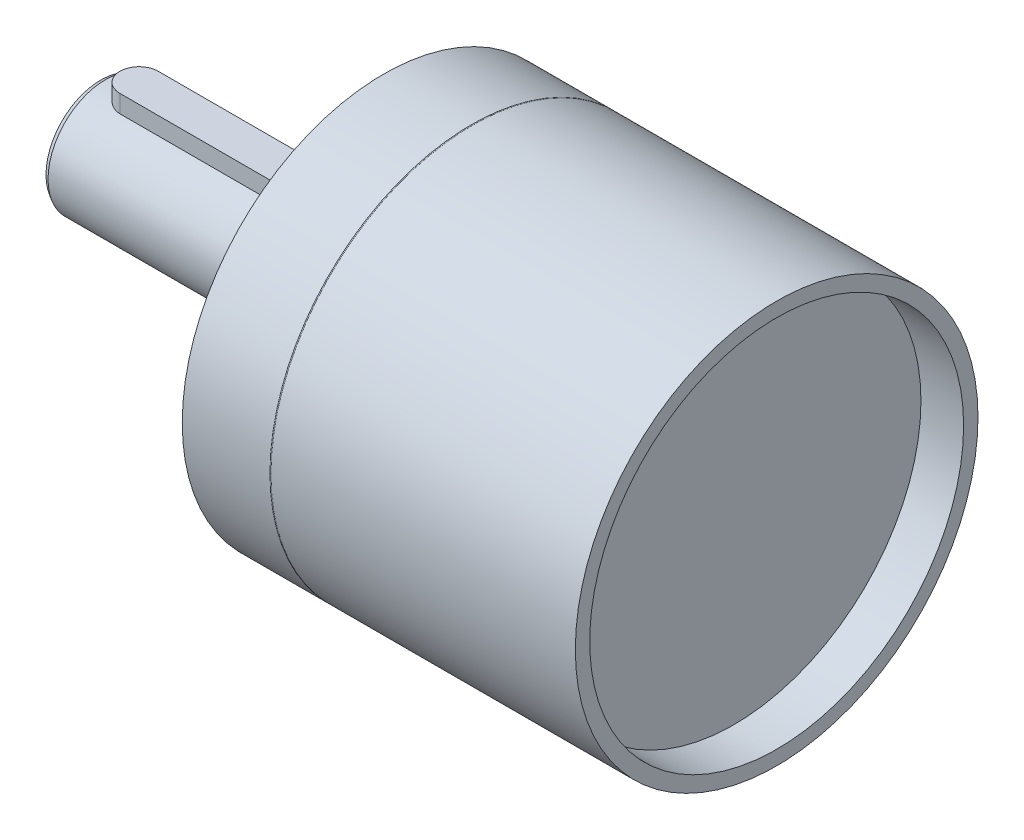
ISO-10303-21;
HEADER;
FILE_DESCRIPTION(('STEP AP214'),'2;1');
FILE_NAME('part.step','',(''),(''),'','','');
FILE_SCHEMA(('AUTOMOTIVE_DESIGN { 1 0 10303 214 1 1 1 1 }'));
ENDSEC;
DATA;
#1=APPLICATION_CONTEXT('core data for automotive mechanical design processes');
#2=APPLICATION_PROTOCOL_DEFINITION('international standard','automotive_design',2000,#1);
#3=PRODUCT_CONTEXT('',#1,'mechanical');
#4=PRODUCT('Part','Part','',(#3));
#5=PRODUCT_RELATED_PRODUCT_CATEGORY('part','',(#4));
#6=PRODUCT_DEFINITION_FORMATION('','',#4);
#7=PRODUCT_DEFINITION_CONTEXT('part definition',#1,'design');
#8=PRODUCT_DEFINITION('design','',#6,#7);
#9=PRODUCT_DEFINITION_SHAPE('','',#8);
#10=(LENGTH_UNIT() NAMED_UNIT(*) SI_UNIT(.MILLI.,.METRE.));
#11=(NAMED_UNIT(*) PLANE_ANGLE_UNIT() SI_UNIT($,.RADIAN.));
#12=(NAMED_UNIT(*) SI_UNIT($,.STERADIAN.) SOLID_ANGLE_UNIT());
#13=UNCERTAINTY_MEASURE_WITH_UNIT(LENGTH_MEASURE(1.E-05),#10,'distance_accuracy_value','');
#14=(GEOMETRIC_REPRESENTATION_CONTEXT(3) GLOBAL_UNCERTAINTY_ASSIGNED_CONTEXT((#13)) GLOBAL_UNIT_ASSIGNED_CONTEXT((#10,
#11,#12)) REPRESENTATION_CONTEXT('',''));
#15=CARTESIAN_POINT('',(0.,0.,0.));
#16=DIRECTION('',(0.,0.,1.));
#17=DIRECTION('',(1.,0.,0.));
#18=AXIS2_PLACEMENT_3D('',#15,#16,#17);
#19=CARTESIAN_POINT('',(0.,1.16808307098715E-12,0.));
#20=DIRECTION('',(1.,0.,0.));
#21=DIRECTION('',(0.,0.,-1.));
#22=AXIS2_PLACEMENT_3D('',#19,#20,#21);
#23=CYLINDRICAL_SURFACE('',#22,21.);
#24=CARTESIAN_POINT('',(0.,1.16808307098715E-12,0.));
#25=DIRECTION('',(1.,0.,0.));
#26=DIRECTION('',(0.,0.,-1.));
#27=AXIS2_PLACEMENT_3D('',#24,#25,#26);
#28=CIRCLE('',#27,21.);
#29=CARTESIAN_POINT('',(0.,1.16808307098715E-12,-21.));
#30=VERTEX_POINT('',#29);
#31=EDGE_CURVE('E198',#30,#30,#28,.T.);
#32=ORIENTED_EDGE('',*,*,#31,.T.);
#33=EDGE_LOOP('',(#32));
#34=FACE_BOUND('',#33,.T.);
#35=CARTESIAN_POINT('',(9.15000000000067,1.16808307098715E-12,0.));
#36=DIRECTION('',(1.,0.,0.));
#37=DIRECTION('',(0.,0.,-1.));
#38=AXIS2_PLACEMENT_3D('',#35,#36,#37);
#39=CIRCLE('',#38,21.);
#40=CARTESIAN_POINT('',(9.15000000000067,1.16808307098715E-12,-21.));
#41=VERTEX_POINT('',#40);
#42=EDGE_CURVE('E209',#41,#41,#39,.T.);
#43=ORIENTED_EDGE('',*,*,#42,.F.);
#44=EDGE_LOOP('',(#43));
#45=FACE_BOUND('',#44,.T.);
#46=ADVANCED_FACE('F34',(#34,#45),#23,.T.);
#47=CARTESIAN_POINT('',(9.20000000000034,1.16920362280837E-12,0.));
#48=DIRECTION('',(1.,0.,0.));
#49=DIRECTION('',(0.,0.,-1.));
#50=AXIS2_PLACEMENT_3D('',#47,#48,#49);
#51=TOROIDAL_SURFACE('',#50,21.0866025403794,0.100000000000672);
#52=ORIENTED_EDGE('',*,*,#42,.T.);
#53=EDGE_LOOP('',(#52));
#54=FACE_BOUND('',#53,.T.);
#55=CARTESIAN_POINT('',(9.25,1.16808307098715E-12,0.));
#56=DIRECTION('',(1.,0.,0.));
#57=DIRECTION('',(0.,0.,-1.));
#58=AXIS2_PLACEMENT_3D('',#55,#56,#57);
#59=CIRCLE('',#58,21.);
#60=CARTESIAN_POINT('',(9.25,1.16808307098715E-12,-21.));
#61=VERTEX_POINT('',#60);
#62=EDGE_CURVE('E206',#61,#61,#59,.T.);
#63=ORIENTED_EDGE('',*,*,#62,.F.);
#64=EDGE_LOOP('',(#63));
#65=FACE_BOUND('',#64,.T.);
#66=ADVANCED_FACE('F226',(#54,#65),#51,.F.);
#67=CARTESIAN_POINT('',(0.,1.16808307098715E-12,0.));
#68=DIRECTION('',(1.,0.,0.));
#69=DIRECTION('',(0.,0.,-1.));
#70=AXIS2_PLACEMENT_3D('',#67,#68,#69);
#71=CYLINDRICAL_SURFACE('',#70,21.);
#72=ORIENTED_EDGE('',*,*,#62,.T.);
#73=EDGE_LOOP('',(#72));
#74=FACE_BOUND('',#73,.T.);
#75=CARTESIAN_POINT('',(41.,1.16808307098715E-12,0.));
#76=DIRECTION('',(1.,0.,0.));
#77=DIRECTION('',(0.,0.,-1.));
#78=AXIS2_PLACEMENT_3D('',#75,#76,#77);
#79=CIRCLE('',#78,21.);
#80=CARTESIAN_POINT('',(41.,1.16808307098715E-12,-21.));
#81=VERTEX_POINT('',#80);
#82=EDGE_CURVE('E203',#81,#81,#79,.T.);
#83=ORIENTED_EDGE('',*,*,#82,.F.);
#84=EDGE_LOOP('',(#83));
#85=FACE_BOUND('',#84,.T.);
#86=ADVANCED_FACE('F231',(#74,#85),#71,.T.);
#87=CARTESIAN_POINT('',(41.,1.16808307098715E-12,0.));
#88=DIRECTION('',(1.,0.,0.));
#89=DIRECTION('',(0.,0.,-1.));
#90=AXIS2_PLACEMENT_3D('',#87,#88,#89);
#91=PLANE('',#90);
#92=CARTESIAN_POINT('',(41.,0.,0.));
#93=DIRECTION('',(1.,0.,0.));
#94=DIRECTION('',(0.,0.,-1.));
#95=AXIS2_PLACEMENT_3D('',#92,#93,#94);
#96=CIRCLE('',#95,19.5);
#97=CARTESIAN_POINT('',(41.,0.,-19.5));
#98=VERTEX_POINT('',#97);
#99=EDGE_CURVE('E139',#98,#98,#96,.T.);
#100=ORIENTED_EDGE('',*,*,#99,.F.);
#101=EDGE_LOOP('',(#100));
#102=FACE_BOUND('',#101,.T.);
#103=ORIENTED_EDGE('',*,*,#82,.T.);
#104=EDGE_LOOP('',(#103));
#105=FACE_BOUND('',#104,.T.);
#106=ADVANCED_FACE('F238',(#102,#105),#91,.T.);
#107=CARTESIAN_POINT('',(0.,21.0000000000012,0.));
#108=DIRECTION('',(-1.,0.,0.));
#109=DIRECTION('',(0.,0.,1.));
#110=AXIS2_PLACEMENT_3D('',#107,#108,#109);
#111=PLANE('',#110);
#112=CARTESIAN_POINT('',(0.,17.49999999997,3.054326190989E-05));
#113=DIRECTION('',(-1.,0.,0.));
#114=DIRECTION('',(0.,0.,1.));
#115=AXIS2_PLACEMENT_3D('',#112,#113,#114);
#116=CIRCLE('',#115,1.64999999999999);
#117=CARTESIAN_POINT('',(0.,17.49999999997,1.6500305432619));
#118=VERTEX_POINT('',#117);
#119=EDGE_CURVE('E102',#118,#118,#116,.T.);
#120=ORIENTED_EDGE('',*,*,#119,.F.);
#121=EDGE_LOOP('',(#120));
#122=FACE_BOUND('',#121,.T.);
#123=CARTESIAN_POINT('',(0.,-3.054326190881E-05,17.49999999997));
#124=DIRECTION('',(-1.,0.,0.));
#125=DIRECTION('',(0.,0.,1.));
#126=AXIS2_PLACEMENT_3D('',#123,#124,#125);
#127=CIRCLE('',#126,1.64999999999999);
#128=CARTESIAN_POINT('',(0.,-3.054326190881E-05,19.14999999997));
#129=VERTEX_POINT('',#128);
#130=EDGE_CURVE('E115',#129,#129,#127,.T.);
#131=ORIENTED_EDGE('',*,*,#130,.F.);
#132=EDGE_LOOP('',(#131));
#133=FACE_BOUND('',#132,.T.);
#134=CARTESIAN_POINT('',(0.,-17.49999999997,-3.054326190774E-05));
#135=DIRECTION('',(-1.,0.,0.));
#136=DIRECTION('',(0.,0.,1.));
#137=AXIS2_PLACEMENT_3D('',#134,#135,#136);
#138=CIRCLE('',#137,1.64999999999999);
#139=CARTESIAN_POINT('',(0.,-17.49999999997,1.64996945673808));
#140=VERTEX_POINT('',#139);
#141=EDGE_CURVE('E121',#140,#140,#138,.T.);
#142=ORIENTED_EDGE('',*,*,#141,.F.);
#143=EDGE_LOOP('',(#142));
#144=FACE_BOUND('',#143,.T.);
#145=CARTESIAN_POINT('',(0.,3.054326190667E-05,-17.49999999997));
#146=DIRECTION('',(-1.,0.,0.));
#147=DIRECTION('',(0.,0.,1.));
#148=AXIS2_PLACEMENT_3D('',#145,#146,#147);
#149=CIRCLE('',#148,1.64999999999999);
#150=CARTESIAN_POINT('',(0.,3.054326190667E-05,-15.84999999997));
#151=VERTEX_POINT('',#150);
#152=EDGE_CURVE('E127',#151,#151,#149,.T.);
#153=ORIENTED_EDGE('',*,*,#152,.F.);
#154=EDGE_LOOP('',(#153));
#155=FACE_BOUND('',#154,.T.);
#156=CARTESIAN_POINT('',(0.,18.01565088397,-7.462326931119));
#157=DIRECTION('',(-1.,0.,0.));
#158=DIRECTION('',(0.,0.,1.));
#159=AXIS2_PLACEMENT_3D('',#156,#157,#158);
#160=CIRCLE('',#159,0.74999999999999);
#161=CARTESIAN_POINT('',(0.,18.01565088397,-6.71232693111901));
#162=VERTEX_POINT('',#161);
#163=EDGE_CURVE('E133',#162,#162,#160,.T.);
#164=ORIENTED_EDGE('',*,*,#163,.F.);
#165=EDGE_LOOP('',(#164));
#166=FACE_BOUND('',#165,.T.);
#167=CARTESIAN_POINT('',(0.,0.,0.));
#168=DIRECTION('',(-1.,0.,0.));
#169=DIRECTION('',(0.,0.,1.));
#170=AXIS2_PLACEMENT_3D('',#167,#168,#169);
#171=CIRCLE('',#170,14.);
#172=CARTESIAN_POINT('',(0.,0.,14.));
#173=VERTEX_POINT('',#172);
#174=EDGE_CURVE('E194',#173,#173,#171,.T.);
#175=ORIENTED_EDGE('',*,*,#174,.F.);
#176=EDGE_LOOP('',(#175));
#177=FACE_BOUND('',#176,.T.);
#178=ORIENTED_EDGE('',*,*,#31,.F.);
#179=EDGE_LOOP('',(#178));
#180=FACE_BOUND('',#179,.T.);
#181=ADVANCED_FACE('F242',(#122,#133,#144,#155,#166,#177,#180),#111,.T.);
#182=CARTESIAN_POINT('',(-3.,0.,0.));
#183=DIRECTION('',(1.,0.,0.));
#184=DIRECTION('',(0.,0.,-1.));
#185=AXIS2_PLACEMENT_3D('',#182,#183,#184);
#186=CYLINDRICAL_SURFACE('',#185,14.);
#187=CARTESIAN_POINT('',(-3.,0.,0.));
#188=DIRECTION('',(-1.,0.,0.));
#189=DIRECTION('',(0.,0.,1.));
#190=AXIS2_PLACEMENT_3D('',#187,#188,#189);
#191=CIRCLE('',#190,14.);
#192=CARTESIAN_POINT('',(-3.,0.,14.));
#193=VERTEX_POINT('',#192);
#194=EDGE_CURVE('E195',#193,#193,#191,.T.);
#195=ORIENTED_EDGE('',*,*,#194,.F.);
#196=EDGE_LOOP('',(#195));
#197=FACE_BOUND('',#196,.T.);
#198=ORIENTED_EDGE('',*,*,#174,.T.);
#199=EDGE_LOOP('',(#198));
#200=FACE_BOUND('',#199,.T.);
#201=ADVANCED_FACE('F246',(#197,#200),#186,.T.);
#202=CARTESIAN_POINT('',(-3.,0.,0.));
#203=DIRECTION('',(-1.,0.,0.));
#204=DIRECTION('',(0.,0.,1.));
#205=AXIS2_PLACEMENT_3D('',#202,#203,#204);
#206=PLANE('',#205);
#207=CARTESIAN_POINT('',(-3.,0.,0.));
#208=DIRECTION('',(-1.,0.,0.));
#209=DIRECTION('',(0.,0.,1.));
#210=AXIS2_PLACEMENT_3D('',#207,#208,#209);
#211=CIRCLE('',#210,6.);
#212=CARTESIAN_POINT('',(-3.,0.,6.));
#213=VERTEX_POINT('',#212);
#214=EDGE_CURVE('E191',#213,#213,#211,.T.);
#215=ORIENTED_EDGE('',*,*,#214,.F.);
#216=EDGE_LOOP('',(#215));
#217=FACE_BOUND('',#216,.T.);
#218=ORIENTED_EDGE('',*,*,#194,.T.);
#219=EDGE_LOOP('',(#218));
#220=FACE_BOUND('',#219,.T.);
#221=ADVANCED_FACE('F250',(#217,#220),#206,.T.);
#222=CARTESIAN_POINT('',(-29.5,0.,0.));
#223=DIRECTION('',(1.,0.,0.));
#224=DIRECTION('',(0.,0.,-1.));
#225=AXIS2_PLACEMENT_3D('',#222,#223,#224);
#226=CYLINDRICAL_SURFACE('',#225,6.);
#227=CARTESIAN_POINT('',(-29.0000000000346,0.,0.));
#228=DIRECTION('',(-1.,0.,0.));
#229=DIRECTION('',(0.,0.,1.));
#230=AXIS2_PLACEMENT_3D('',#227,#228,#229);
#231=CIRCLE('',#230,6.);
#232=CARTESIAN_POINT('',(-29.0000000000346,0.,6.));
#233=VERTEX_POINT('',#232);
#234=EDGE_CURVE('E11',#233,#233,#231,.F.);
#235=ORIENTED_EDGE('',*,*,#234,.T.);
#236=EDGE_LOOP('',(#235));
#237=FACE_BOUND('',#236,.T.);
#238=CARTESIAN_POINT('',(-25.5,5.65685424949238,-2.));
#239=CARTESIAN_POINT('',(-25.5545809936022,5.65684884188678,-2.0000014949184));
#240=CARTESIAN_POINT('',(-25.6091341243787,5.6576451988649,-1.99776424917478));
#241=CARTESIAN_POINT('',(-25.7178171681098,5.66078654578442,-1.9888512140728));
#242=CARTESIAN_POINT('',(-25.7719471913194,5.66313111768244,-1.98217662286705));
#243=CARTESIAN_POINT('',(-25.9327842863903,5.67238184449301,-1.95562135046158));
#244=CARTESIAN_POINT('',(-26.038361692541,5.6815058499903,-1.92920846605623));
#245=CARTESIAN_POINT('',(-26.2432503848876,5.70456149397718,-1.85991682366086));
#246=CARTESIAN_POINT('',(-26.3425650937458,5.71849047905858,-1.81704715197507));
#247=CARTESIAN_POINT('',(-26.5326796680109,5.74957574438921,-1.71614645792974));
#248=CARTESIAN_POINT('',(-26.6234742581347,5.76673400456216,-1.65810612564547));
#249=CARTESIAN_POINT('',(-26.7974404626491,5.80308960804095,-1.52610278704603));
#250=CARTESIAN_POINT('',(-26.8802297609252,5.82233755536618,-1.45164996064407));
#251=CARTESIAN_POINT('',(-27.0324120355834,5.86027697385956,-1.28997688598297));
#252=CARTESIAN_POINT('',(-27.1018026265119,5.87896834543705,-1.20275436910907));
#253=CARTESIAN_POINT('',(-27.2269590376084,5.91427765988454,-1.01520729191253));
#254=CARTESIAN_POINT('',(-27.2823219688045,5.93082875123708,-0.914600178716994));
#255=CARTESIAN_POINT('',(-27.3751845033745,5.95939217209317,-0.704858499931718));
#256=CARTESIAN_POINT('',(-27.4126895636409,5.97140588786619,-0.59572655118684));
#257=CARTESIAN_POINT('',(-27.4674714521827,5.98918142285845,-0.376058690956074));
#258=CARTESIAN_POINT('',(-27.4854065451074,5.99514617977147,-0.265703668920224));
#259=CARTESIAN_POINT('',(-27.5026325970512,6.00087216807634,-0.0433979389113466));
#260=CARTESIAN_POINT('',(-27.5019279985395,6.00063487762605,0.0685523824907838));
#261=CARTESIAN_POINT('',(-27.4823114337867,5.99412077270532,0.286207690558783));
#262=CARTESIAN_POINT('',(-27.4641147240811,5.98808121982527,0.391985405251071));
#263=CARTESIAN_POINT('',(-27.4112136026518,5.97093921001647,0.598888128753311));
#264=CARTESIAN_POINT('',(-27.3765082755875,5.95983647235462,0.700012879232927));
#265=CARTESIAN_POINT('',(-27.2911572607987,5.93351336542608,0.896305246061924));
#266=CARTESIAN_POINT('',(-27.2403079097553,5.91824075676625,0.991377011307983));
#267=CARTESIAN_POINT('',(-27.1242800972186,5.88516775360088,1.17184917819498));
#268=CARTESIAN_POINT('',(-27.059097737907,5.86736667195186,1.25724693942937));
#269=CARTESIAN_POINT('',(-26.9126579000063,5.83012543885479,1.42019467942243));
#270=CARTESIAN_POINT('',(-26.8307889127806,5.81064757359828,1.4971872232254));
#271=CARTESIAN_POINT('',(-26.6551170205677,5.77294980945702,1.63654404964077));
#272=CARTESIAN_POINT('',(-26.5613102751935,5.75473031831506,1.69890360636763));
#273=CARTESIAN_POINT('',(-26.3626396432934,5.72140062752635,1.80800665118557));
#274=CARTESIAN_POINT('',(-26.2576329701341,5.70634029896469,1.85450601901537));
#275=CARTESIAN_POINT('',(-26.0407060448201,5.68162194124078,1.92892046140223));
#276=CARTESIAN_POINT('',(-25.9287970132557,5.67195538817985,1.95686487211071));
#277=CARTESIAN_POINT('',(-25.763162726504,5.6627308418944,1.98331631256166));
#278=CARTESIAN_POINT('',(-25.7107172202915,5.66053335389204,1.98957012251023));
#279=CARTESIAN_POINT('',(-25.6055238432004,5.65759407142798,1.99790923214239));
#280=CARTESIAN_POINT('',(-25.5527764509112,5.65685039859056,1.99999991078996));
#281=CARTESIAN_POINT('',(-25.5,5.65685424949238,2.));
#282=B_SPLINE_CURVE_WITH_KNOTS('',3,(#238,#239,#240,#241,#242,#243,#244,#245,#246,#247,#248,
#249,#250,#251,#252,#253,#254,#255,#256,#257,#258,#259,#260,#261,#262,#263,#264,#265,#266,#267,
#268,#269,#270,#271,#272,#273,#274,#275,#276,#277,#278,#279,#280,#281),.UNSPECIFIED.,.F.,.F.,(4,
2,2,2,2,2,2,2,2,2,2,2,2,2,2,2,2,2,2,2,2,4),(0.,0.163636969470864,0.327229772338923,
0.653162396790745,0.97891532193247,1.30486862627062,1.64233009925355,1.97985159727495,
2.32618265866202,2.67240782242255,3.00658941454806,3.34069136061284,3.6616883693147,
3.98270317816496,4.30794037651935,4.63326613177537,4.97388108116101,5.31460588498485,
5.6603605985608,6.00556734973678,6.16399790665503,6.32222363058113),.UNSPECIFIED.);
#283=CARTESIAN_POINT('',(-25.5,5.65685424949238,-2.));
#284=VERTEX_POINT('',#283);
#285=CARTESIAN_POINT('',(-25.5,5.65685424949238,2.));
#286=VERTEX_POINT('',#285);
#287=EDGE_CURVE('E166',#284,#286,#282,.T.);
#288=ORIENTED_EDGE('',*,*,#287,.F.);
#289=DIRECTION('',(1.,0.,0.));
#290=VECTOR('',#289,1.);
#291=CARTESIAN_POINT('',(-29.5,5.65685424949238,-2.));
#292=LINE('',#291,#290);
#293=CARTESIAN_POINT('',(-9.5,5.65685424948015,-2.));
#294=VERTEX_POINT('',#293);
#295=EDGE_CURVE('E173',#294,#284,#292,.F.);
#296=ORIENTED_EDGE('',*,*,#295,.F.);
#297=CARTESIAN_POINT('',(-9.5,5.65685424949238,2.));
#298=CARTESIAN_POINT('',(-9.44541900639777,5.65684884188678,2.0000014949184));
#299=CARTESIAN_POINT('',(-9.39086587562134,5.6576451988649,1.99776424917478));
#300=CARTESIAN_POINT('',(-9.28218283189021,5.66078654578442,1.9888512140728));
#301=CARTESIAN_POINT('',(-9.22805280868061,5.66313111768244,1.98217662286705));
#302=CARTESIAN_POINT('',(-9.06721571360973,5.67238184449301,1.95562135046158));
#303=CARTESIAN_POINT('',(-8.96163830745905,5.6815058499903,1.92920846605623));
#304=CARTESIAN_POINT('',(-8.75674961511245,5.70456149397718,1.85991682366086));
#305=CARTESIAN_POINT('',(-8.65743490625416,5.71849047905858,1.81704715197507));
#306=CARTESIAN_POINT('',(-8.46732033198908,5.74957574438921,1.71614645792974));
#307=CARTESIAN_POINT('',(-8.37652574186531,5.76673400456216,1.65810612564547));
#308=CARTESIAN_POINT('',(-8.20255953735094,5.80308960804095,1.52610278704603));
#309=CARTESIAN_POINT('',(-8.11977023907478,5.82233755536618,1.45164996064408));
#310=CARTESIAN_POINT('',(-7.96758796441661,5.86027697385956,1.28997688598297));
#311=CARTESIAN_POINT('',(-7.89819737348812,5.87896834543705,1.20275436910907));
#312=CARTESIAN_POINT('',(-7.77304096239161,5.91427765988454,1.01520729191253));
#313=CARTESIAN_POINT('',(-7.71767803119549,5.93082875123708,0.914600178716996));
#314=CARTESIAN_POINT('',(-7.62481549662547,5.95939217209316,0.704858499931721));
#315=CARTESIAN_POINT('',(-7.58731043635913,5.97140588786619,0.595726551186843));
#316=CARTESIAN_POINT('',(-7.53252854781725,5.98918142285845,0.376058690956076));
#317=CARTESIAN_POINT('',(-7.51459345489264,5.99514617977147,0.265703668920226));
#318=CARTESIAN_POINT('',(-7.49736740294878,6.00087216807634,0.0433979389113482));
#319=CARTESIAN_POINT('',(-7.4980720014605,6.00063487762605,-0.0685523824907828));
#320=CARTESIAN_POINT('',(-7.51768856621331,5.99412077270532,-0.286207690558783));
#321=CARTESIAN_POINT('',(-7.53588527591893,5.98808121982527,-0.391985405251071));
#322=CARTESIAN_POINT('',(-7.58878639734824,5.97093921001647,-0.598888128753311));
#323=CARTESIAN_POINT('',(-7.6234917244125,5.95983647235462,-0.700012879232927));
#324=CARTESIAN_POINT('',(-7.70884273920126,5.93351336542608,-0.896305246061923));
#325=CARTESIAN_POINT('',(-7.75969209024468,5.91824075676625,-0.991377011307982));
#326=CARTESIAN_POINT('',(-7.8757199027814,5.88516775360088,-1.17184917819498));
#327=CARTESIAN_POINT('',(-7.94090226209303,5.86736667195186,-1.25724693942937));
#328=CARTESIAN_POINT('',(-8.08734209999369,5.83012543885479,-1.42019467942242));
#329=CARTESIAN_POINT('',(-8.16921108721941,5.81064757359828,-1.4971872232254));
#330=CARTESIAN_POINT('',(-8.34488297943233,5.77294980945702,-1.63654404964077));
#331=CARTESIAN_POINT('',(-8.43868972480648,5.75473031831506,-1.69890360636763));
#332=CARTESIAN_POINT('',(-8.63736035670656,5.72140062752635,-1.80800665118557));
#333=CARTESIAN_POINT('',(-8.74236702986588,5.70634029896469,-1.85450601901537));
#334=CARTESIAN_POINT('',(-8.95929395517991,5.68162194124078,-1.92892046140223));
#335=CARTESIAN_POINT('',(-9.0712029867443,5.67195538817985,-1.95686487211071));
#336=CARTESIAN_POINT('',(-9.23683727349596,5.6627308418944,-1.98331631256166));
#337=CARTESIAN_POINT('',(-9.28928277970846,5.66053335389204,-1.98957012251023));
#338=CARTESIAN_POINT('',(-9.39447615679962,5.65759407142798,-1.99790923214239));
#339=CARTESIAN_POINT('',(-9.44722354908881,5.65685039859056,-1.99999991078996));
#340=CARTESIAN_POINT('',(-9.5,5.65685424949238,-2.));
#341=B_SPLINE_CURVE_WITH_KNOTS('',3,(#297,#298,#299,#300,#301,#302,#303,#304,#305,#306,#307,
#308,#309,#310,#311,#312,#313,#314,#315,#316,#317,#318,#319,#320,#321,#322,#323,#324,#325,#326,
#327,#328,#329,#330,#331,#332,#333,#334,#335,#336,#337,#338,#339,#340),.UNSPECIFIED.,.F.,.F.,(4,
2,2,2,2,2,2,2,2,2,2,2,2,2,2,2,2,2,2,2,2,4),(0.,0.163636969470865,0.327229772338922,
0.653162396790745,0.978915321932472,1.30486862627062,1.64233009925355,1.97985159727495,
2.32618265866202,2.67240782242254,3.00658941454806,3.34069136061284,3.6616883693147,
3.98270317816496,4.30794037651935,4.63326613177537,4.973881081161,5.31460588498484,
5.6603605985608,6.00556734973678,6.16399790665503,6.32222363058113),.UNSPECIFIED.);
#342=CARTESIAN_POINT('',(-9.5,5.65685424948015,2.));
#343=VERTEX_POINT('',#342);
#344=EDGE_CURVE('E57',#343,#294,#341,.T.);
#345=ORIENTED_EDGE('',*,*,#344,.F.);
#346=DIRECTION('',(1.,0.,0.));
#347=VECTOR('',#346,1.);
#348=CARTESIAN_POINT('',(-29.5,5.65685424949238,2.));
#349=LINE('',#348,#347);
#350=EDGE_CURVE('E164',#286,#343,#349,.T.);
#351=ORIENTED_EDGE('',*,*,#350,.F.);
#352=EDGE_LOOP('',(#288,#296,#345,#351));
#353=FACE_BOUND('',#352,.T.);
#354=ORIENTED_EDGE('',*,*,#214,.T.);
#355=EDGE_LOOP('',(#354));
#356=FACE_BOUND('',#355,.T.);
#357=ADVANCED_FACE('F253',(#237,#353,#356),#226,.T.);
#358=CARTESIAN_POINT('',(-29.5,0.,0.));
#359=DIRECTION('',(-1.,0.,0.));
#360=DIRECTION('',(0.,0.,1.));
#361=AXIS2_PLACEMENT_3D('',#358,#359,#360);
#362=PLANE('',#361);
#363=CARTESIAN_POINT('',(-29.5,0.,0.));
#364=DIRECTION('',(-1.,0.,0.));
#365=DIRECTION('',(0.,0.,1.));
#366=AXIS2_PLACEMENT_3D('',#363,#364,#365);
#367=CIRCLE('',#366,5.71132486542906);
#368=CARTESIAN_POINT('',(-29.5,0.,5.71132486542906));
#369=VERTEX_POINT('',#368);
#370=EDGE_CURVE('E42',#369,#369,#367,.T.);
#371=ORIENTED_EDGE('',*,*,#370,.T.);
#372=EDGE_LOOP('',(#371));
#373=FACE_BOUND('',#372,.T.);
#374=CARTESIAN_POINT('',(-29.5,0.,0.));
#375=DIRECTION('',(-1.,0.,0.));
#376=DIRECTION('',(0.,0.,1.));
#377=AXIS2_PLACEMENT_3D('',#374,#375,#376);
#378=CIRCLE('',#377,1.32500000000846);
#379=CARTESIAN_POINT('',(-29.5,0.,1.32500000000846));
#380=VERTEX_POINT('',#379);
#381=EDGE_CURVE('E109',#380,#380,#378,.T.);
#382=ORIENTED_EDGE('',*,*,#381,.F.);
#383=EDGE_LOOP('',(#382));
#384=FACE_BOUND('',#383,.T.);
#385=ADVANCED_FACE('F184',(#373,#384),#362,.T.);
#386=CARTESIAN_POINT('',(-9.5,-500000.,-2.));
#387=DIRECTION('',(0.,0.,-1.));
#388=DIRECTION('',(-1.,0.,0.));
#389=AXIS2_PLACEMENT_3D('',#386,#387,#388);
#390=PLANE('',#389);
#391=DIRECTION('',(0.,1.,0.));
#392=VECTOR('',#391,1.);
#393=CARTESIAN_POINT('',(-9.5,-500000.,-2.));
#394=LINE('',#393,#392);
#395=CARTESIAN_POINT('',(-9.5,7.5,-2.));
#396=VERTEX_POINT('',#395);
#397=EDGE_CURVE('E162',#294,#396,#394,.T.);
#398=ORIENTED_EDGE('',*,*,#397,.F.);
#399=ORIENTED_EDGE('',*,*,#295,.T.);
#400=DIRECTION('',(0.,1.,0.));
#401=VECTOR('',#400,1.);
#402=CARTESIAN_POINT('',(-25.5,-500000.,-2.));
#403=LINE('',#402,#401);
#404=CARTESIAN_POINT('',(-25.5,7.5,-2.));
#405=VERTEX_POINT('',#404);
#406=EDGE_CURVE('E160',#284,#405,#403,.T.);
#407=ORIENTED_EDGE('',*,*,#406,.T.);
#408=DIRECTION('',(-1.,0.,0.));
#409=VECTOR('',#408,1.);
#410=CARTESIAN_POINT('',(-9.5,7.5,-2.));
#411=LINE('',#410,#409);
#412=EDGE_CURVE('E146',#396,#405,#411,.T.);
#413=ORIENTED_EDGE('',*,*,#412,.F.);
#414=EDGE_LOOP('',(#398,#399,#407,#413));
#415=FACE_BOUND('',#414,.T.);
#416=ADVANCED_FACE('F260',(#415),#390,.T.);
#417=CARTESIAN_POINT('',(-9.5,7.5,0.));
#418=DIRECTION('',(0.,1.,0.));
#419=DIRECTION('',(0.,0.,1.));
#420=AXIS2_PLACEMENT_3D('',#417,#418,#419);
#421=PLANE('',#420);
#422=CARTESIAN_POINT('',(-9.5,7.5,0.));
#423=DIRECTION('',(0.,1.,0.));
#424=DIRECTION('',(0.,0.,1.));
#425=AXIS2_PLACEMENT_3D('',#422,#423,#424);
#426=CIRCLE('',#425,2.);
#427=CARTESIAN_POINT('',(-9.5,7.5,2.));
#428=VERTEX_POINT('',#427);
#429=EDGE_CURVE('E145',#428,#396,#426,.T.);
#430=ORIENTED_EDGE('',*,*,#429,.T.);
#431=ORIENTED_EDGE('',*,*,#412,.T.);
#432=CARTESIAN_POINT('',(-25.5,7.5,0.));
#433=DIRECTION('',(0.,1.,0.));
#434=DIRECTION('',(0.,0.,1.));
#435=AXIS2_PLACEMENT_3D('',#432,#433,#434);
#436=CIRCLE('',#435,2.);
#437=CARTESIAN_POINT('',(-25.5,7.5,2.));
#438=VERTEX_POINT('',#437);
#439=EDGE_CURVE('E149',#405,#438,#436,.T.);
#440=ORIENTED_EDGE('',*,*,#439,.T.);
#441=DIRECTION('',(1.,0.,0.));
#442=VECTOR('',#441,1.);
#443=CARTESIAN_POINT('',(-25.5,7.5,2.));
#444=LINE('',#443,#442);
#445=EDGE_CURVE('E152',#438,#428,#444,.T.);
#446=ORIENTED_EDGE('',*,*,#445,.T.);
#447=EDGE_LOOP('',(#430,#431,#440,#446));
#448=FACE_BOUND('',#447,.T.);
#449=ADVANCED_FACE('F282',(#448),#421,.T.);
#450=CARTESIAN_POINT('',(-9.5,-500000.,0.));
#451=DIRECTION('',(0.,1.,0.));
#452=DIRECTION('',(0.,0.,1.));
#453=AXIS2_PLACEMENT_3D('',#450,#451,#452);
#454=CYLINDRICAL_SURFACE('',#453,2.);
#455=DIRECTION('',(0.,1.,0.));
#456=VECTOR('',#455,1.);
#457=CARTESIAN_POINT('',(-9.5,-500000.,2.));
#458=LINE('',#457,#456);
#459=EDGE_CURVE('E155',#343,#428,#458,.T.);
#460=ORIENTED_EDGE('',*,*,#459,.F.);
#461=ORIENTED_EDGE('',*,*,#344,.T.);
#462=ORIENTED_EDGE('',*,*,#397,.T.);
#463=ORIENTED_EDGE('',*,*,#429,.F.);
#464=EDGE_LOOP('',(#460,#461,#462,#463));
#465=FACE_BOUND('',#464,.T.);
#466=ADVANCED_FACE('F182',(#465),#454,.T.);
#467=CARTESIAN_POINT('',(-25.5,-500000.,0.));
#468=DIRECTION('',(0.,1.,0.));
#469=DIRECTION('',(0.,0.,1.));
#470=AXIS2_PLACEMENT_3D('',#467,#468,#469);
#471=CYLINDRICAL_SURFACE('',#470,2.);
#472=ORIENTED_EDGE('',*,*,#406,.F.);
#473=ORIENTED_EDGE('',*,*,#287,.T.);
#474=DIRECTION('',(0.,1.,0.));
#475=VECTOR('',#474,1.);
#476=CARTESIAN_POINT('',(-25.5,-500000.,2.));
#477=LINE('',#476,#475);
#478=EDGE_CURVE('E49',#286,#438,#477,.T.);
#479=ORIENTED_EDGE('',*,*,#478,.T.);
#480=ORIENTED_EDGE('',*,*,#439,.F.);
#481=EDGE_LOOP('',(#472,#473,#479,#480));
#482=FACE_BOUND('',#481,.T.);
#483=ADVANCED_FACE('F175',(#482),#471,.T.);
#484=CARTESIAN_POINT('',(-25.5,-500000.,2.));
#485=DIRECTION('',(0.,0.,1.));
#486=DIRECTION('',(1.,0.,0.));
#487=AXIS2_PLACEMENT_3D('',#484,#485,#486);
#488=PLANE('',#487);
#489=ORIENTED_EDGE('',*,*,#478,.F.);
#490=ORIENTED_EDGE('',*,*,#350,.T.);
#491=ORIENTED_EDGE('',*,*,#459,.T.);
#492=ORIENTED_EDGE('',*,*,#445,.F.);
#493=EDGE_LOOP('',(#489,#490,#491,#492));
#494=FACE_BOUND('',#493,.T.);
#495=ADVANCED_FACE('F261',(#494),#488,.T.);
#496=CARTESIAN_POINT('',(36.55,0.,0.));
#497=DIRECTION('',(-1.,0.,0.));
#498=DIRECTION('',(0.,0.,1.));
#499=AXIS2_PLACEMENT_3D('',#496,#497,#498);
#500=PLANE('',#499);
#501=CARTESIAN_POINT('',(36.55,0.,0.));
#502=DIRECTION('',(1.,0.,0.));
#503=DIRECTION('',(0.,0.,-1.));
#504=AXIS2_PLACEMENT_3D('',#501,#502,#503);
#505=CIRCLE('',#504,19.5);
#506=CARTESIAN_POINT('',(36.55,0.,-19.5));
#507=VERTEX_POINT('',#506);
#508=EDGE_CURVE('E142',#507,#507,#505,.T.);
#509=ORIENTED_EDGE('',*,*,#508,.T.);
#510=EDGE_LOOP('',(#509));
#511=FACE_BOUND('',#510,.T.);
#512=ADVANCED_FACE('F284',(#511),#500,.F.);
#513=CARTESIAN_POINT('',(41.,0.,0.));
#514=DIRECTION('',(1.,0.,0.));
#515=DIRECTION('',(0.,0.,-1.));
#516=AXIS2_PLACEMENT_3D('',#513,#514,#515);
#517=CYLINDRICAL_SURFACE('',#516,19.5);
#518=ORIENTED_EDGE('',*,*,#508,.F.);
#519=EDGE_LOOP('',(#518));
#520=FACE_BOUND('',#519,.T.);
#521=ORIENTED_EDGE('',*,*,#99,.T.);
#522=EDGE_LOOP('',(#521));
#523=FACE_BOUND('',#522,.T.);
#524=ADVANCED_FACE('F289',(#520,#523),#517,.F.);
#525=CARTESIAN_POINT('',(2.,18.01565088397,-7.462326931119));
#526=DIRECTION('',(-1.,0.,0.));
#527=DIRECTION('',(0.,0.,1.));
#528=AXIS2_PLACEMENT_3D('',#525,#526,#527);
#529=CONICAL_SURFACE('',#528,0.749999999999987,1.02974425868404);
#530=CARTESIAN_POINT('',(2.45064546426313,18.01565088397,-7.462326931119));
#531=VERTEX_POINT('',#530);
#532=VERTEX_LOOP('',#531);
#533=FACE_BOUND('',#532,.T.);
#534=CARTESIAN_POINT('',(2.,18.01565088397,-7.462326931119));
#535=DIRECTION('',(-1.,0.,0.));
#536=DIRECTION('',(0.,0.,1.));
#537=AXIS2_PLACEMENT_3D('',#534,#535,#536);
#538=CIRCLE('',#537,0.749999999999987);
#539=CARTESIAN_POINT('',(2.,18.01565088397,-6.71232693111901));
#540=VERTEX_POINT('',#539);
#541=EDGE_CURVE('E136',#540,#540,#538,.T.);
#542=ORIENTED_EDGE('',*,*,#541,.T.);
#543=EDGE_LOOP('',(#542));
#544=FACE_BOUND('',#543,.T.);
#545=ADVANCED_FACE('F297',(#533,#544),#529,.F.);
#546=CARTESIAN_POINT('',(0.,18.01565088397,-7.462326931119));
#547=DIRECTION('',(-1.,0.,0.));
#548=DIRECTION('',(0.,0.,1.));
#549=AXIS2_PLACEMENT_3D('',#546,#547,#548);
#550=CYLINDRICAL_SURFACE('',#549,0.749999999999989);
#551=ORIENTED_EDGE('',*,*,#541,.F.);
#552=EDGE_LOOP('',(#551));
#553=FACE_BOUND('',#552,.T.);
#554=ORIENTED_EDGE('',*,*,#163,.T.);
#555=EDGE_LOOP('',(#554));
#556=FACE_BOUND('',#555,.T.);
#557=ADVANCED_FACE('F301',(#553,#556),#550,.F.);
#558=CARTESIAN_POINT('',(6.00000000000001,3.054326190667E-05,-17.49999999997));
#559=DIRECTION('',(-1.,0.,0.));
#560=DIRECTION('',(0.,0.,1.));
#561=AXIS2_PLACEMENT_3D('',#558,#559,#560);
#562=CONICAL_SURFACE('',#561,1.64999999999999,1.02974425866086);
#563=CARTESIAN_POINT('',(6.99142002143094,3.05432619049576E-05,-17.49999999997));
#564=VERTEX_POINT('',#563);
#565=VERTEX_LOOP('',#564);
#566=FACE_BOUND('',#565,.T.);
#567=CARTESIAN_POINT('',(6.00000000000001,3.054326190667E-05,-17.49999999997));
#568=DIRECTION('',(-1.,0.,0.));
#569=DIRECTION('',(0.,0.,1.));
#570=AXIS2_PLACEMENT_3D('',#567,#568,#569);
#571=CIRCLE('',#570,1.64999999999999);
#572=CARTESIAN_POINT('',(6.00000000000001,3.054326190667E-05,-15.84999999997));
#573=VERTEX_POINT('',#572);
#574=EDGE_CURVE('E130',#573,#573,#571,.T.);
#575=ORIENTED_EDGE('',*,*,#574,.T.);
#576=EDGE_LOOP('',(#575));
#577=FACE_BOUND('',#576,.T.);
#578=ADVANCED_FACE('F305',(#566,#577),#562,.F.);
#579=CARTESIAN_POINT('',(0.,3.054326190667E-05,-17.49999999997));
#580=DIRECTION('',(-1.,0.,0.));
#581=DIRECTION('',(0.,0.,1.));
#582=AXIS2_PLACEMENT_3D('',#579,#580,#581);
#583=CYLINDRICAL_SURFACE('',#582,1.64999999999999);
#584=ORIENTED_EDGE('',*,*,#574,.F.);
#585=EDGE_LOOP('',(#584));
#586=FACE_BOUND('',#585,.T.);
#587=ORIENTED_EDGE('',*,*,#152,.T.);
#588=EDGE_LOOP('',(#587));
#589=FACE_BOUND('',#588,.T.);
#590=ADVANCED_FACE('F309',(#586,#589),#583,.F.);
#591=CARTESIAN_POINT('',(6.00000000000001,-17.49999999997,-3.054326190774E-05));
#592=DIRECTION('',(-1.,0.,0.));
#593=DIRECTION('',(0.,0.,1.));
#594=AXIS2_PLACEMENT_3D('',#591,#592,#593);
#595=CONICAL_SURFACE('',#594,1.64999999999999,1.02974425866086);
#596=CARTESIAN_POINT('',(6.99142002143094,-17.49999999997,-3.054326190774E-05));
#597=VERTEX_POINT('',#596);
#598=VERTEX_LOOP('',#597);
#599=FACE_BOUND('',#598,.T.);
#600=CARTESIAN_POINT('',(6.00000000000001,-17.49999999997,-3.054326190774E-05));
#601=DIRECTION('',(-1.,0.,0.));
#602=DIRECTION('',(0.,0.,1.));
#603=AXIS2_PLACEMENT_3D('',#600,#601,#602);
#604=CIRCLE('',#603,1.64999999999999);
#605=CARTESIAN_POINT('',(6.00000000000001,-17.49999999997,1.64996945673808));
#606=VERTEX_POINT('',#605);
#607=EDGE_CURVE('E124',#606,#606,#604,.T.);
#608=ORIENTED_EDGE('',*,*,#607,.T.);
#609=EDGE_LOOP('',(#608));
#610=FACE_BOUND('',#609,.T.);
#611=ADVANCED_FACE('F313',(#599,#610),#595,.F.);
#612=CARTESIAN_POINT('',(0.,-17.49999999997,-3.054326190774E-05));
#613=DIRECTION('',(-1.,0.,0.));
#614=DIRECTION('',(0.,0.,1.));
#615=AXIS2_PLACEMENT_3D('',#612,#613,#614);
#616=CYLINDRICAL_SURFACE('',#615,1.64999999999999);
#617=ORIENTED_EDGE('',*,*,#607,.F.);
#618=EDGE_LOOP('',(#617));
#619=FACE_BOUND('',#618,.T.);
#620=ORIENTED_EDGE('',*,*,#141,.T.);
#621=EDGE_LOOP('',(#620));
#622=FACE_BOUND('',#621,.T.);
#623=ADVANCED_FACE('F317',(#619,#622),#616,.F.);
#624=CARTESIAN_POINT('',(6.00000000000001,-3.054326190881E-05,17.49999999997));
#625=DIRECTION('',(-1.,0.,0.));
#626=DIRECTION('',(0.,0.,1.));
#627=AXIS2_PLACEMENT_3D('',#624,#625,#626);
#628=CONICAL_SURFACE('',#627,1.64999999999999,1.02974425866086);
#629=CARTESIAN_POINT('',(6.99142002143094,-3.05432619105224E-05,17.49999999997));
#630=VERTEX_POINT('',#629);
#631=VERTEX_LOOP('',#630);
#632=FACE_BOUND('',#631,.T.);
#633=CARTESIAN_POINT('',(6.00000000000001,-3.054326190881E-05,17.49999999997));
#634=DIRECTION('',(-1.,0.,0.));
#635=DIRECTION('',(0.,0.,1.));
#636=AXIS2_PLACEMENT_3D('',#633,#634,#635);
#637=CIRCLE('',#636,1.64999999999999);
#638=CARTESIAN_POINT('',(6.00000000000001,-3.054326190881E-05,19.14999999997));
#639=VERTEX_POINT('',#638);
#640=EDGE_CURVE('E118',#639,#639,#637,.T.);
#641=ORIENTED_EDGE('',*,*,#640,.T.);
#642=EDGE_LOOP('',(#641));
#643=FACE_BOUND('',#642,.T.);
#644=ADVANCED_FACE('F321',(#632,#643),#628,.F.);
#645=CARTESIAN_POINT('',(0.,-3.054326190881E-05,17.49999999997));
#646=DIRECTION('',(-1.,0.,0.));
#647=DIRECTION('',(0.,0.,1.));
#648=AXIS2_PLACEMENT_3D('',#645,#646,#647);
#649=CYLINDRICAL_SURFACE('',#648,1.64999999999999);
#650=ORIENTED_EDGE('',*,*,#640,.F.);
#651=EDGE_LOOP('',(#650));
#652=FACE_BOUND('',#651,.T.);
#653=ORIENTED_EDGE('',*,*,#130,.T.);
#654=EDGE_LOOP('',(#653));
#655=FACE_BOUND('',#654,.T.);
#656=ADVANCED_FACE('F325',(#652,#655),#649,.F.);
#657=CARTESIAN_POINT('',(6.00000000000001,17.49999999997,3.054326190989E-05));
#658=DIRECTION('',(-1.,0.,0.));
#659=DIRECTION('',(0.,0.,1.));
#660=AXIS2_PLACEMENT_3D('',#657,#658,#659);
#661=CONICAL_SURFACE('',#660,1.64999999999999,1.02974425866086);
#662=CARTESIAN_POINT('',(6.99142002143094,17.49999999997,3.054326190989E-05));
#663=VERTEX_POINT('',#662);
#664=VERTEX_LOOP('',#663);
#665=FACE_BOUND('',#664,.T.);
#666=CARTESIAN_POINT('',(6.00000000000001,17.49999999997,3.054326190989E-05));
#667=DIRECTION('',(-1.,0.,0.));
#668=DIRECTION('',(0.,0.,1.));
#669=AXIS2_PLACEMENT_3D('',#666,#667,#668);
#670=CIRCLE('',#669,1.64999999999999);
#671=CARTESIAN_POINT('',(6.00000000000001,17.49999999997,1.6500305432619));
#672=VERTEX_POINT('',#671);
#673=EDGE_CURVE('E106',#672,#672,#670,.T.);
#674=ORIENTED_EDGE('',*,*,#673,.T.);
#675=EDGE_LOOP('',(#674));
#676=FACE_BOUND('',#675,.T.);
#677=ADVANCED_FACE('F329',(#665,#676),#661,.F.);
#678=CARTESIAN_POINT('',(0.,17.49999999997,3.054326190989E-05));
#679=DIRECTION('',(-1.,0.,0.));
#680=DIRECTION('',(0.,0.,1.));
#681=AXIS2_PLACEMENT_3D('',#678,#679,#680);
#682=CYLINDRICAL_SURFACE('',#681,1.64999999999999);
#683=ORIENTED_EDGE('',*,*,#673,.F.);
#684=EDGE_LOOP('',(#683));
#685=FACE_BOUND('',#684,.T.);
#686=ORIENTED_EDGE('',*,*,#119,.T.);
#687=EDGE_LOOP('',(#686));
#688=FACE_BOUND('',#687,.T.);
#689=ADVANCED_FACE('F96',(#685,#688),#682,.F.);
#690=CARTESIAN_POINT('',(-27.5608439182555,0.,0.));
#691=DIRECTION('',(-1.,0.,0.));
#692=DIRECTION('',(0.,0.,1.));
#693=AXIS2_PLACEMENT_3D('',#690,#691,#692);
#694=CONICAL_SURFACE('',#693,0.62500000001363,1.04719755117748);
#695=CARTESIAN_POINT('',(-27.1999999999881,0.,0.));
#696=VERTEX_POINT('',#695);
#697=VERTEX_LOOP('',#696);
#698=FACE_BOUND('',#697,.T.);
#699=CARTESIAN_POINT('',(-27.5608439182555,0.,0.));
#700=DIRECTION('',(-1.,0.,0.));
#701=DIRECTION('',(0.,0.,1.));
#702=AXIS2_PLACEMENT_3D('',#699,#700,#701);
#703=CIRCLE('',#702,0.62500000001363);
#704=CARTESIAN_POINT('',(-27.5608439182555,0.,0.62500000001363));
#705=VERTEX_POINT('',#704);
#706=EDGE_CURVE('E100',#705,#705,#703,.T.);
#707=ORIENTED_EDGE('',*,*,#706,.T.);
#708=EDGE_LOOP('',(#707));
#709=FACE_BOUND('',#708,.T.);
#710=ADVANCED_FACE('F92',(#698,#709),#694,.F.);
#711=CARTESIAN_POINT('',(-29.5,0.,0.));
#712=DIRECTION('',(-1.,0.,0.));
#713=DIRECTION('',(0.,0.,1.));
#714=AXIS2_PLACEMENT_3D('',#711,#712,#713);
#715=CYLINDRICAL_SURFACE('',#714,0.625000000013631);
#716=ORIENTED_EDGE('',*,*,#706,.F.);
#717=EDGE_LOOP('',(#716));
#718=FACE_BOUND('',#717,.T.);
#719=CARTESIAN_POINT('',(-28.2875644346786,0.,0.));
#720=DIRECTION('',(-1.,0.,0.));
#721=DIRECTION('',(0.,0.,1.));
#722=AXIS2_PLACEMENT_3D('',#719,#720,#721);
#723=CIRCLE('',#722,0.625000000013632);
#724=CARTESIAN_POINT('',(-28.2875644346786,0.,0.625000000013632));
#725=VERTEX_POINT('',#724);
#726=EDGE_CURVE('E103',#725,#725,#723,.T.);
#727=ORIENTED_EDGE('',*,*,#726,.T.);
#728=EDGE_LOOP('',(#727));
#729=FACE_BOUND('',#728,.T.);
#730=ADVANCED_FACE('F95',(#718,#729),#715,.F.);
#731=CARTESIAN_POINT('',(-29.5,0.,0.));
#732=DIRECTION('',(-1.,0.,0.));
#733=DIRECTION('',(0.,0.,1.));
#734=AXIS2_PLACEMENT_3D('',#731,#732,#733);
#735=CONICAL_SURFACE('',#734,1.32500000000846,0.523598775586827);
#736=ORIENTED_EDGE('',*,*,#726,.F.);
#737=EDGE_LOOP('',(#736));
#738=FACE_BOUND('',#737,.T.);
#739=ORIENTED_EDGE('',*,*,#381,.T.);
#740=EDGE_LOOP('',(#739));
#741=FACE_BOUND('',#740,.T.);
#742=ADVANCED_FACE('F217',(#738,#741),#735,.F.);
#743=CARTESIAN_POINT('',(-29.5,0.,0.));
#744=DIRECTION('',(1.,0.,0.));
#745=DIRECTION('',(0.,0.,-1.));
#746=AXIS2_PLACEMENT_3D('',#743,#744,#745);
#747=CONICAL_SURFACE('',#746,5.71132486542906,0.523598775592442);
#748=ORIENTED_EDGE('',*,*,#234,.F.);
#749=EDGE_LOOP('',(#748));
#750=FACE_BOUND('',#749,.T.);
#751=ORIENTED_EDGE('',*,*,#370,.F.);
#752=EDGE_LOOP('',(#751));
#753=FACE_BOUND('',#752,.T.);
#754=ADVANCED_FACE('F36',(#750,#753),#747,.T.);
#755=CLOSED_SHELL('',(#46,#66,#86,#106,#181,#201,#221,#357,#385,#416,#449,#466,#483,#495,#512,
#524,#545,#557,#578,#590,#611,#623,#644,#656,#677,#689,#710,#730,#742,#754));
#756=MANIFOLD_SOLID_BREP('B2',#755);
#757=ADVANCED_BREP_SHAPE_REPRESENTATION('',(#18,#756),#14);
#758=SHAPE_DEFINITION_REPRESENTATION(#9,#757);
ENDSEC;
END-ISO-10303-21;
